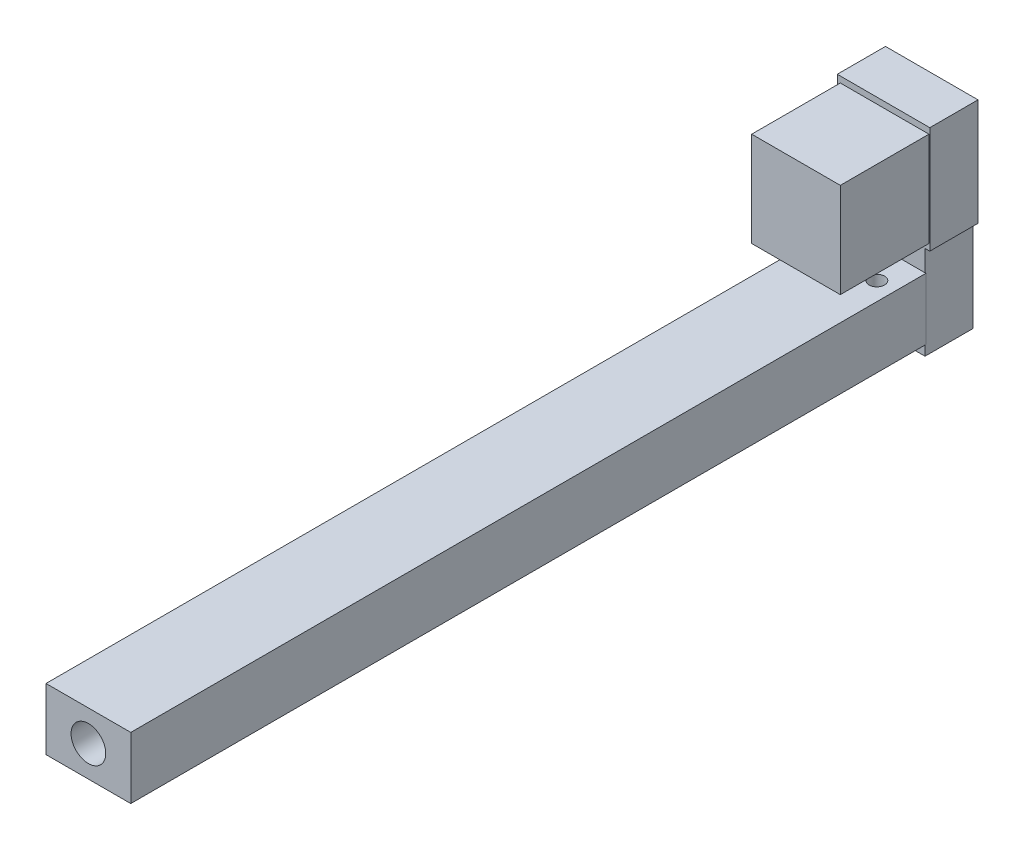
ISO-10303-21;
HEADER;
FILE_DESCRIPTION(('STEP AP214'),'2;1');
FILE_NAME('part.step','',(''),(''),'','','');
FILE_SCHEMA(('AUTOMOTIVE_DESIGN { 1 0 10303 214 1 1 1 1 }'));
ENDSEC;
DATA;
#1=APPLICATION_CONTEXT('core data for automotive mechanical design processes');
#2=APPLICATION_PROTOCOL_DEFINITION('international standard','automotive_design',2000,#1);
#3=PRODUCT_CONTEXT('',#1,'mechanical');
#4=PRODUCT('Part','Part','',(#3));
#5=PRODUCT_RELATED_PRODUCT_CATEGORY('part','',(#4));
#6=PRODUCT_DEFINITION_FORMATION('','',#4);
#7=PRODUCT_DEFINITION_CONTEXT('part definition',#1,'design');
#8=PRODUCT_DEFINITION('design','',#6,#7);
#9=PRODUCT_DEFINITION_SHAPE('','',#8);
#10=(LENGTH_UNIT() NAMED_UNIT(*) SI_UNIT(.MILLI.,.METRE.));
#11=(NAMED_UNIT(*) PLANE_ANGLE_UNIT() SI_UNIT($,.RADIAN.));
#12=(NAMED_UNIT(*) SI_UNIT($,.STERADIAN.) SOLID_ANGLE_UNIT());
#13=UNCERTAINTY_MEASURE_WITH_UNIT(LENGTH_MEASURE(1.E-05),#10,'distance_accuracy_value','');
#14=(GEOMETRIC_REPRESENTATION_CONTEXT(3) GLOBAL_UNCERTAINTY_ASSIGNED_CONTEXT((#13)) GLOBAL_UNIT_ASSIGNED_CONTEXT((#10,
#11,#12)) REPRESENTATION_CONTEXT('',''));
#15=CARTESIAN_POINT('',(0.,0.,0.));
#16=DIRECTION('',(0.,0.,1.));
#17=DIRECTION('',(1.,0.,0.));
#18=AXIS2_PLACEMENT_3D('',#15,#16,#17);
#19=CARTESIAN_POINT('',(68.326,0.,0.));
#20=DIRECTION('',(0.,0.,-1.));
#21=DIRECTION('',(0.,1.,0.));
#22=AXIS2_PLACEMENT_3D('',#19,#20,#21);
#23=PLANE('',#22);
#24=DIRECTION('',(-1.,0.,0.));
#25=VECTOR('',#24,1.);
#26=CARTESIAN_POINT('',(69.85,50.8000000000002,0.));
#27=LINE('',#26,#25);
#28=CARTESIAN_POINT('',(68.326,50.8000000000002,0.));
#29=VERTEX_POINT('',#28);
#30=CARTESIAN_POINT('',(-68.326,50.8000000000002,0.));
#31=VERTEX_POINT('',#30);
#32=EDGE_CURVE('E282',#29,#31,#27,.T.);
#33=ORIENTED_EDGE('',*,*,#32,.F.);
#34=DIRECTION('',(0.,-1.,0.));
#35=VECTOR('',#34,1.);
#36=CARTESIAN_POINT('',(68.326,85.598,0.));
#37=LINE('',#36,#35);
#38=CARTESIAN_POINT('',(68.326,85.598,0.));
#39=VERTEX_POINT('',#38);
#40=EDGE_CURVE('E234',#39,#29,#37,.T.);
#41=ORIENTED_EDGE('',*,*,#40,.F.);
#42=DIRECTION('',(-1.,0.,0.));
#43=VECTOR('',#42,1.);
#44=CARTESIAN_POINT('',(76.23,85.598,0.));
#45=LINE('',#44,#43);
#46=CARTESIAN_POINT('',(76.23,85.598,0.));
#47=VERTEX_POINT('',#46);
#48=EDGE_CURVE('E223',#47,#39,#45,.T.);
#49=ORIENTED_EDGE('',*,*,#48,.F.);
#50=DIRECTION('',(0.,-1.,0.));
#51=VECTOR('',#50,1.);
#52=CARTESIAN_POINT('',(76.23,85.598,0.));
#53=LINE('',#52,#51);
#54=CARTESIAN_POINT('',(76.23,261.868,0.));
#55=VERTEX_POINT('',#54);
#56=EDGE_CURVE('E197',#55,#47,#53,.T.);
#57=ORIENTED_EDGE('',*,*,#56,.F.);
#58=DIRECTION('',(-1.,0.,0.));
#59=VECTOR('',#58,1.);
#60=CARTESIAN_POINT('',(76.23,261.868,0.));
#61=LINE('',#60,#59);
#62=CARTESIAN_POINT('',(-76.23,261.868,0.));
#63=VERTEX_POINT('',#62);
#64=EDGE_CURVE('E206',#55,#63,#61,.T.);
#65=ORIENTED_EDGE('',*,*,#64,.T.);
#66=DIRECTION('',(0.,-1.,0.));
#67=VECTOR('',#66,1.);
#68=CARTESIAN_POINT('',(-76.23,85.598,0.));
#69=LINE('',#68,#67);
#70=CARTESIAN_POINT('',(-76.23,85.598,0.));
#71=VERTEX_POINT('',#70);
#72=EDGE_CURVE('E188',#63,#71,#69,.T.);
#73=ORIENTED_EDGE('',*,*,#72,.T.);
#74=CARTESIAN_POINT('',(-68.326,85.598,0.));
#75=VERTEX_POINT('',#74);
#76=EDGE_CURVE('E222',#75,#71,#45,.T.);
#77=ORIENTED_EDGE('',*,*,#76,.F.);
#78=DIRECTION('',(0.,-1.,0.));
#79=VECTOR('',#78,1.);
#80=CARTESIAN_POINT('',(-68.326,0.,0.));
#81=LINE('',#80,#79);
#82=EDGE_CURVE('E50',#75,#31,#81,.T.);
#83=ORIENTED_EDGE('',*,*,#82,.T.);
#84=EDGE_LOOP('',(#33,#41,#49,#57,#65,#73,#77,#83));
#85=FACE_BOUND('',#84,.T.);
#86=DIRECTION('',(0.,-1.,0.));
#87=VECTOR('',#86,1.);
#88=CARTESIAN_POINT('',(-71.23,251.868,0.));
#89=LINE('',#88,#87);
#90=CARTESIAN_POINT('',(-71.23,251.868,0.));
#91=VERTEX_POINT('',#90);
#92=CARTESIAN_POINT('',(-71.23,95.828,0.));
#93=VERTEX_POINT('',#92);
#94=EDGE_CURVE('E187',#91,#93,#89,.T.);
#95=ORIENTED_EDGE('',*,*,#94,.F.);
#96=DIRECTION('',(-1.,0.,0.));
#97=VECTOR('',#96,1.);
#98=CARTESIAN_POINT('',(-71.23,251.868,0.));
#99=LINE('',#98,#97);
#100=CARTESIAN_POINT('',(74.81,251.868,0.));
#101=VERTEX_POINT('',#100);
#102=EDGE_CURVE('E184',#101,#91,#99,.T.);
#103=ORIENTED_EDGE('',*,*,#102,.F.);
#104=DIRECTION('',(0.,1.,0.));
#105=VECTOR('',#104,1.);
#106=CARTESIAN_POINT('',(74.81,251.868,0.));
#107=LINE('',#106,#105);
#108=CARTESIAN_POINT('',(74.81,95.828,0.));
#109=VERTEX_POINT('',#108);
#110=EDGE_CURVE('E63',#109,#101,#107,.T.);
#111=ORIENTED_EDGE('',*,*,#110,.F.);
#112=DIRECTION('',(1.,0.,0.));
#113=VECTOR('',#112,1.);
#114=CARTESIAN_POINT('',(-71.23,95.828,0.));
#115=LINE('',#114,#113);
#116=EDGE_CURVE('E58',#93,#109,#115,.T.);
#117=ORIENTED_EDGE('',*,*,#116,.F.);
#118=EDGE_LOOP('',(#95,#103,#111,#117));
#119=FACE_BOUND('',#118,.T.);
#120=ADVANCED_FACE('F39',(#85,#119),#23,.F.);
#121=CARTESIAN_POINT('',(69.85,50.8000000000002,0.));
#122=DIRECTION('',(0.,0.,1.));
#123=DIRECTION('',(0.,-1.,0.));
#124=AXIS2_PLACEMENT_3D('',#121,#122,#123);
#125=PLANE('',#124);
#126=CARTESIAN_POINT('',(68.326,-50.8000000000002,0.));
#127=VERTEX_POINT('',#126);
#128=EDGE_CURVE('E48',#29,#127,#37,.T.);
#129=ORIENTED_EDGE('',*,*,#128,.F.);
#130=CARTESIAN_POINT('',(69.85,50.8000000000002,0.));
#131=VERTEX_POINT('',#130);
#132=EDGE_CURVE('E280',#131,#29,#27,.T.);
#133=ORIENTED_EDGE('',*,*,#132,.F.);
#134=DIRECTION('',(0.,1.,0.));
#135=VECTOR('',#134,1.);
#136=CARTESIAN_POINT('',(69.85,50.8000000000002,0.));
#137=LINE('',#136,#135);
#138=CARTESIAN_POINT('',(69.85,-50.8000000000002,0.));
#139=VERTEX_POINT('',#138);
#140=EDGE_CURVE('E252',#139,#131,#137,.T.);
#141=ORIENTED_EDGE('',*,*,#140,.F.);
#142=DIRECTION('',(-1.,0.,0.));
#143=VECTOR('',#142,1.);
#144=CARTESIAN_POINT('',(69.85,-50.8000000000002,0.));
#145=LINE('',#144,#143);
#146=EDGE_CURVE('E271',#139,#127,#145,.T.);
#147=ORIENTED_EDGE('',*,*,#146,.T.);
#148=EDGE_LOOP('',(#129,#133,#141,#147));
#149=FACE_BOUND('',#148,.T.);
#150=ADVANCED_FACE('F313',(#149),#125,.F.);
#151=CARTESIAN_POINT('',(-69.85,50.8000000000002,0.));
#152=VERTEX_POINT('',#151);
#153=EDGE_CURVE('E279',#31,#152,#27,.T.);
#154=ORIENTED_EDGE('',*,*,#153,.F.);
#155=CARTESIAN_POINT('',(-68.326,-50.8000000000002,0.));
#156=VERTEX_POINT('',#155);
#157=EDGE_CURVE('E11',#31,#156,#81,.T.);
#158=ORIENTED_EDGE('',*,*,#157,.T.);
#159=CARTESIAN_POINT('',(-69.85,-50.8000000000002,0.));
#160=VERTEX_POINT('',#159);
#161=EDGE_CURVE('E262',#156,#160,#145,.T.);
#162=ORIENTED_EDGE('',*,*,#161,.T.);
#163=DIRECTION('',(0.,1.,0.));
#164=VECTOR('',#163,1.);
#165=CARTESIAN_POINT('',(-69.85,50.8000000000002,0.));
#166=LINE('',#165,#164);
#167=EDGE_CURVE('E251',#160,#152,#166,.T.);
#168=ORIENTED_EDGE('',*,*,#167,.T.);
#169=EDGE_LOOP('',(#154,#158,#162,#168));
#170=FACE_BOUND('',#169,.T.);
#171=ADVANCED_FACE('F41',(#170),#125,.F.);
#172=CARTESIAN_POINT('',(69.85,50.8000000000002,0.));
#173=DIRECTION('',(0.,-1.,0.));
#174=DIRECTION('',(0.,0.,-1.));
#175=AXIS2_PLACEMENT_3D('',#172,#173,#174);
#176=PLANE('',#175);
#177=CARTESIAN_POINT('',(39.81,50.8000000000002,50.7999999999999));
#178=DIRECTION('',(0.,-1.,0.));
#179=DIRECTION('',(0.,0.,-1.));
#180=AXIS2_PLACEMENT_3D('',#177,#178,#179);
#181=CIRCLE('',#180,12.7);
#182=CARTESIAN_POINT('',(39.81,50.8000000000002,38.0999999999999));
#183=VERTEX_POINT('',#182);
#184=EDGE_CURVE('E397',#183,#183,#181,.T.);
#185=ORIENTED_EDGE('',*,*,#184,.T.);
#186=EDGE_LOOP('',(#185));
#187=FACE_BOUND('',#186,.T.);
#188=DIRECTION('',(0.,0.,1.));
#189=VECTOR('',#188,1.);
#190=CARTESIAN_POINT('',(-69.85,50.8000000000002,0.));
#191=LINE('',#190,#189);
#192=CARTESIAN_POINT('',(-69.85,50.7999999999996,1310.386));
#193=VERTEX_POINT('',#192);
#194=EDGE_CURVE('E265',#152,#193,#191,.T.);
#195=ORIENTED_EDGE('',*,*,#194,.T.);
#196=DIRECTION('',(-1.,0.,0.));
#197=VECTOR('',#196,1.);
#198=CARTESIAN_POINT('',(69.85,50.7999999999996,1310.386));
#199=LINE('',#198,#197);
#200=CARTESIAN_POINT('',(69.85,50.7999999999996,1310.386));
#201=VERTEX_POINT('',#200);
#202=EDGE_CURVE('E277',#201,#193,#199,.T.);
#203=ORIENTED_EDGE('',*,*,#202,.F.);
#204=DIRECTION('',(0.,0.,1.));
#205=VECTOR('',#204,1.);
#206=CARTESIAN_POINT('',(69.85,50.8000000000002,0.));
#207=LINE('',#206,#205);
#208=EDGE_CURVE('E255',#131,#201,#207,.T.);
#209=ORIENTED_EDGE('',*,*,#208,.F.);
#210=ORIENTED_EDGE('',*,*,#132,.T.);
#211=ORIENTED_EDGE('',*,*,#32,.T.);
#212=ORIENTED_EDGE('',*,*,#153,.T.);
#213=EDGE_LOOP('',(#195,#203,#209,#210,#211,#212));
#214=FACE_BOUND('',#213,.T.);
#215=ADVANCED_FACE('F289',(#187,#214),#176,.F.);
#216=CARTESIAN_POINT('',(69.85,50.7999999999996,1310.386));
#217=DIRECTION('',(0.,0.,-1.));
#218=DIRECTION('',(-1.,0.,0.));
#219=AXIS2_PLACEMENT_3D('',#216,#217,#218);
#220=PLANE('',#219);
#221=CARTESIAN_POINT('',(0.,0.,1310.386));
#222=DIRECTION('',(0.,0.,1.));
#223=DIRECTION('',(1.,0.,0.));
#224=AXIS2_PLACEMENT_3D('',#221,#222,#223);
#225=CIRCLE('',#224,28.575);
#226=CARTESIAN_POINT('',(28.575,0.,1310.386));
#227=VERTEX_POINT('',#226);
#228=EDGE_CURVE('E399',#227,#227,#225,.T.);
#229=ORIENTED_EDGE('',*,*,#228,.F.);
#230=EDGE_LOOP('',(#229));
#231=FACE_BOUND('',#230,.T.);
#232=DIRECTION('',(0.,-1.,0.));
#233=VECTOR('',#232,1.);
#234=CARTESIAN_POINT('',(-69.85,50.7999999999996,1310.386));
#235=LINE('',#234,#233);
#236=CARTESIAN_POINT('',(-69.85,-50.8000000000004,1310.386));
#237=VERTEX_POINT('',#236);
#238=EDGE_CURVE('E267',#193,#237,#235,.T.);
#239=ORIENTED_EDGE('',*,*,#238,.T.);
#240=DIRECTION('',(-1.,0.,0.));
#241=VECTOR('',#240,1.);
#242=CARTESIAN_POINT('',(69.85,-50.8000000000004,1310.386));
#243=LINE('',#242,#241);
#244=CARTESIAN_POINT('',(69.85,-50.8000000000004,1310.386));
#245=VERTEX_POINT('',#244);
#246=EDGE_CURVE('E273',#245,#237,#243,.T.);
#247=ORIENTED_EDGE('',*,*,#246,.F.);
#248=DIRECTION('',(0.,-1.,0.));
#249=VECTOR('',#248,1.);
#250=CARTESIAN_POINT('',(69.85,50.7999999999996,1310.386));
#251=LINE('',#250,#249);
#252=EDGE_CURVE('E258',#201,#245,#251,.T.);
#253=ORIENTED_EDGE('',*,*,#252,.F.);
#254=ORIENTED_EDGE('',*,*,#202,.T.);
#255=EDGE_LOOP('',(#239,#247,#253,#254));
#256=FACE_BOUND('',#255,.T.);
#257=ADVANCED_FACE('F308',(#231,#256),#220,.F.);
#258=CARTESIAN_POINT('',(69.85,-50.8000000000002,0.));
#259=DIRECTION('',(0.,1.,0.));
#260=DIRECTION('',(0.,0.,1.));
#261=AXIS2_PLACEMENT_3D('',#258,#259,#260);
#262=PLANE('',#261);
#263=CARTESIAN_POINT('',(39.81,-50.8000000000002,50.7999999999998));
#264=DIRECTION('',(0.,1.,0.));
#265=DIRECTION('',(0.,0.,1.));
#266=AXIS2_PLACEMENT_3D('',#263,#264,#265);
#267=CIRCLE('',#266,12.7);
#268=CARTESIAN_POINT('',(39.81,-50.8000000000002,63.4999999999999));
#269=VERTEX_POINT('',#268);
#270=EDGE_CURVE('E43',#269,#269,#267,.T.);
#271=ORIENTED_EDGE('',*,*,#270,.T.);
#272=EDGE_LOOP('',(#271));
#273=FACE_BOUND('',#272,.T.);
#274=DIRECTION('',(0.,0.,-1.));
#275=VECTOR('',#274,1.);
#276=CARTESIAN_POINT('',(-69.85,-50.8000000000002,0.));
#277=LINE('',#276,#275);
#278=EDGE_CURVE('E256',#237,#160,#277,.T.);
#279=ORIENTED_EDGE('',*,*,#278,.T.);
#280=ORIENTED_EDGE('',*,*,#161,.F.);
#281=EDGE_CURVE('E274',#127,#156,#145,.T.);
#282=ORIENTED_EDGE('',*,*,#281,.F.);
#283=ORIENTED_EDGE('',*,*,#146,.F.);
#284=DIRECTION('',(0.,0.,-1.));
#285=VECTOR('',#284,1.);
#286=CARTESIAN_POINT('',(69.85,-50.8000000000002,0.));
#287=LINE('',#286,#285);
#288=EDGE_CURVE('E260',#245,#139,#287,.T.);
#289=ORIENTED_EDGE('',*,*,#288,.F.);
#290=ORIENTED_EDGE('',*,*,#246,.T.);
#291=EDGE_LOOP('',(#279,#280,#282,#283,#289,#290));
#292=FACE_BOUND('',#291,.T.);
#293=ADVANCED_FACE('F302',(#273,#292),#262,.F.);
#294=CARTESIAN_POINT('',(69.85,0.,0.));
#295=DIRECTION('',(-1.,0.,0.));
#296=DIRECTION('',(0.,0.,1.));
#297=AXIS2_PLACEMENT_3D('',#294,#295,#296);
#298=PLANE('',#297);
#299=ORIENTED_EDGE('',*,*,#140,.T.);
#300=ORIENTED_EDGE('',*,*,#208,.T.);
#301=ORIENTED_EDGE('',*,*,#252,.T.);
#302=ORIENTED_EDGE('',*,*,#288,.T.);
#303=EDGE_LOOP('',(#299,#300,#301,#302));
#304=FACE_BOUND('',#303,.T.);
#305=ADVANCED_FACE('F311',(#304),#298,.F.);
#306=CARTESIAN_POINT('',(-69.85,0.,0.));
#307=DIRECTION('',(-1.,0.,0.));
#308=DIRECTION('',(0.,0.,1.));
#309=AXIS2_PLACEMENT_3D('',#306,#307,#308);
#310=PLANE('',#309);
#311=ORIENTED_EDGE('',*,*,#167,.F.);
#312=ORIENTED_EDGE('',*,*,#278,.F.);
#313=ORIENTED_EDGE('',*,*,#238,.F.);
#314=ORIENTED_EDGE('',*,*,#194,.F.);
#315=EDGE_LOOP('',(#311,#312,#313,#314));
#316=FACE_BOUND('',#315,.T.);
#317=ADVANCED_FACE('F296',(#316),#310,.T.);
#318=CARTESIAN_POINT('',(68.326,-68.326,0.));
#319=VERTEX_POINT('',#318);
#320=EDGE_CURVE('E233',#127,#319,#37,.T.);
#321=ORIENTED_EDGE('',*,*,#320,.F.);
#322=ORIENTED_EDGE('',*,*,#281,.T.);
#323=CARTESIAN_POINT('',(-68.326,-68.326,0.));
#324=VERTEX_POINT('',#323);
#325=EDGE_CURVE('E51',#156,#324,#81,.T.);
#326=ORIENTED_EDGE('',*,*,#325,.T.);
#327=DIRECTION('',(-1.,0.,0.));
#328=VECTOR('',#327,1.);
#329=CARTESIAN_POINT('',(68.326,-68.326,0.));
#330=LINE('',#329,#328);
#331=EDGE_CURVE('E248',#319,#324,#330,.T.);
#332=ORIENTED_EDGE('',*,*,#331,.F.);
#333=EDGE_LOOP('',(#321,#322,#326,#332));
#334=FACE_BOUND('',#333,.T.);
#335=ADVANCED_FACE('F331',(#334),#23,.F.);
#336=CARTESIAN_POINT('',(68.326,-68.326,-79.4308383840396));
#337=DIRECTION('',(0.,0.,1.));
#338=DIRECTION('',(1.,0.,0.));
#339=AXIS2_PLACEMENT_3D('',#336,#337,#338);
#340=PLANE('',#339);
#341=DIRECTION('',(0.,1.,0.));
#342=VECTOR('',#341,1.);
#343=CARTESIAN_POINT('',(-68.326,-68.326,-79.4308383840396));
#344=LINE('',#343,#342);
#345=CARTESIAN_POINT('',(-68.326,-68.326,-79.4308383840396));
#346=VERTEX_POINT('',#345);
#347=CARTESIAN_POINT('',(-68.326,85.598,-79.4308383840396));
#348=VERTEX_POINT('',#347);
#349=EDGE_CURVE('E225',#346,#348,#344,.T.);
#350=ORIENTED_EDGE('',*,*,#349,.T.);
#351=DIRECTION('',(-1.,0.,0.));
#352=VECTOR('',#351,1.);
#353=CARTESIAN_POINT('',(76.23,85.598,-79.4308383840396));
#354=LINE('',#353,#352);
#355=CARTESIAN_POINT('',(-76.23,85.598,-79.4308383840396));
#356=VERTEX_POINT('',#355);
#357=EDGE_CURVE('E218',#348,#356,#354,.T.);
#358=ORIENTED_EDGE('',*,*,#357,.T.);
#359=DIRECTION('',(0.,1.,0.));
#360=VECTOR('',#359,1.);
#361=CARTESIAN_POINT('',(-76.23,85.598,-79.4308383840396));
#362=LINE('',#361,#360);
#363=CARTESIAN_POINT('',(-76.23,261.868,-79.4308383840396));
#364=VERTEX_POINT('',#363);
#365=EDGE_CURVE('E210',#356,#364,#362,.T.);
#366=ORIENTED_EDGE('',*,*,#365,.T.);
#367=DIRECTION('',(-1.,0.,0.));
#368=VECTOR('',#367,1.);
#369=CARTESIAN_POINT('',(76.23,261.868,-79.4308383840396));
#370=LINE('',#369,#368);
#371=CARTESIAN_POINT('',(76.23,261.868,-79.4308383840396));
#372=VERTEX_POINT('',#371);
#373=EDGE_CURVE('E215',#372,#364,#370,.T.);
#374=ORIENTED_EDGE('',*,*,#373,.F.);
#375=DIRECTION('',(0.,1.,0.));
#376=VECTOR('',#375,1.);
#377=CARTESIAN_POINT('',(76.23,85.598,-79.4308383840396));
#378=LINE('',#377,#376);
#379=CARTESIAN_POINT('',(76.23,85.598,-79.4308383840396));
#380=VERTEX_POINT('',#379);
#381=EDGE_CURVE('E203',#380,#372,#378,.T.);
#382=ORIENTED_EDGE('',*,*,#381,.F.);
#383=CARTESIAN_POINT('',(68.326,85.598,-79.4308383840396));
#384=VERTEX_POINT('',#383);
#385=EDGE_CURVE('E219',#380,#384,#354,.T.);
#386=ORIENTED_EDGE('',*,*,#385,.T.);
#387=DIRECTION('',(0.,1.,0.));
#388=VECTOR('',#387,1.);
#389=CARTESIAN_POINT('',(68.326,-68.326,-79.4308383840396));
#390=LINE('',#389,#388);
#391=CARTESIAN_POINT('',(68.326,-68.326,-79.4308383840396));
#392=VERTEX_POINT('',#391);
#393=EDGE_CURVE('E226',#392,#384,#390,.T.);
#394=ORIENTED_EDGE('',*,*,#393,.F.);
#395=DIRECTION('',(-1.,0.,0.));
#396=VECTOR('',#395,1.);
#397=CARTESIAN_POINT('',(68.326,-68.326,-79.4308383840396));
#398=LINE('',#397,#396);
#399=EDGE_CURVE('E239',#392,#346,#398,.T.);
#400=ORIENTED_EDGE('',*,*,#399,.T.);
#401=EDGE_LOOP('',(#350,#358,#366,#374,#382,#386,#394,#400));
#402=FACE_BOUND('',#401,.T.);
#403=ADVANCED_FACE('F338',(#402),#340,.F.);
#404=CARTESIAN_POINT('',(68.326,-68.326,0.));
#405=DIRECTION('',(0.,1.,0.));
#406=DIRECTION('',(0.,0.,1.));
#407=AXIS2_PLACEMENT_3D('',#404,#405,#406);
#408=PLANE('',#407);
#409=DIRECTION('',(0.,0.,-1.));
#410=VECTOR('',#409,1.);
#411=CARTESIAN_POINT('',(-68.326,-68.326,0.));
#412=LINE('',#411,#410);
#413=EDGE_CURVE('E230',#324,#346,#412,.T.);
#414=ORIENTED_EDGE('',*,*,#413,.T.);
#415=ORIENTED_EDGE('',*,*,#399,.F.);
#416=DIRECTION('',(0.,0.,-1.));
#417=VECTOR('',#416,1.);
#418=CARTESIAN_POINT('',(68.326,-68.326,0.));
#419=LINE('',#418,#417);
#420=EDGE_CURVE('E237',#319,#392,#419,.T.);
#421=ORIENTED_EDGE('',*,*,#420,.F.);
#422=ORIENTED_EDGE('',*,*,#331,.T.);
#423=EDGE_LOOP('',(#414,#415,#421,#422));
#424=FACE_BOUND('',#423,.T.);
#425=ADVANCED_FACE('F334',(#424),#408,.F.);
#426=CARTESIAN_POINT('',(68.326,0.,0.));
#427=DIRECTION('',(1.,0.,0.));
#428=DIRECTION('',(0.,0.,-1.));
#429=AXIS2_PLACEMENT_3D('',#426,#427,#428);
#430=PLANE('',#429);
#431=ORIENTED_EDGE('',*,*,#393,.T.);
#432=DIRECTION('',(0.,0.,1.));
#433=VECTOR('',#432,1.);
#434=CARTESIAN_POINT('',(68.326,85.598,-79.4308383840396));
#435=LINE('',#434,#433);
#436=EDGE_CURVE('E229',#384,#39,#435,.T.);
#437=ORIENTED_EDGE('',*,*,#436,.T.);
#438=ORIENTED_EDGE('',*,*,#40,.T.);
#439=ORIENTED_EDGE('',*,*,#128,.T.);
#440=ORIENTED_EDGE('',*,*,#320,.T.);
#441=ORIENTED_EDGE('',*,*,#420,.T.);
#442=EDGE_LOOP('',(#431,#437,#438,#439,#440,#441));
#443=FACE_BOUND('',#442,.T.);
#444=ADVANCED_FACE('F315',(#443),#430,.T.);
#445=CARTESIAN_POINT('',(-68.326,0.,0.));
#446=DIRECTION('',(1.,0.,0.));
#447=DIRECTION('',(0.,0.,-1.));
#448=AXIS2_PLACEMENT_3D('',#445,#446,#447);
#449=PLANE('',#448);
#450=ORIENTED_EDGE('',*,*,#349,.F.);
#451=ORIENTED_EDGE('',*,*,#413,.F.);
#452=ORIENTED_EDGE('',*,*,#325,.F.);
#453=ORIENTED_EDGE('',*,*,#157,.F.);
#454=ORIENTED_EDGE('',*,*,#82,.F.);
#455=DIRECTION('',(0.,0.,1.));
#456=VECTOR('',#455,1.);
#457=CARTESIAN_POINT('',(-68.326,85.598,-79.4308383840396));
#458=LINE('',#457,#456);
#459=EDGE_CURVE('E242',#348,#75,#458,.T.);
#460=ORIENTED_EDGE('',*,*,#459,.F.);
#461=EDGE_LOOP('',(#450,#451,#452,#453,#454,#460));
#462=FACE_BOUND('',#461,.T.);
#463=ADVANCED_FACE('F327',(#462),#449,.F.);
#464=CARTESIAN_POINT('',(76.23,85.598,0.));
#465=DIRECTION('',(0.,1.,0.));
#466=DIRECTION('',(0.,0.,1.));
#467=AXIS2_PLACEMENT_3D('',#464,#465,#466);
#468=PLANE('',#467);
#469=ORIENTED_EDGE('',*,*,#357,.F.);
#470=ORIENTED_EDGE('',*,*,#459,.T.);
#471=ORIENTED_EDGE('',*,*,#76,.T.);
#472=DIRECTION('',(0.,0.,-1.));
#473=VECTOR('',#472,1.);
#474=CARTESIAN_POINT('',(-76.23,85.598,0.));
#475=LINE('',#474,#473);
#476=EDGE_CURVE('E191',#71,#356,#475,.T.);
#477=ORIENTED_EDGE('',*,*,#476,.T.);
#478=EDGE_LOOP('',(#469,#470,#471,#477));
#479=FACE_BOUND('',#478,.T.);
#480=ADVANCED_FACE('F356',(#479),#468,.F.);
#481=ORIENTED_EDGE('',*,*,#436,.F.);
#482=ORIENTED_EDGE('',*,*,#385,.F.);
#483=DIRECTION('',(0.,0.,-1.));
#484=VECTOR('',#483,1.);
#485=CARTESIAN_POINT('',(76.23,85.598,0.));
#486=LINE('',#485,#484);
#487=EDGE_CURVE('E200',#47,#380,#486,.T.);
#488=ORIENTED_EDGE('',*,*,#487,.F.);
#489=ORIENTED_EDGE('',*,*,#48,.T.);
#490=EDGE_LOOP('',(#481,#482,#488,#489));
#491=FACE_BOUND('',#490,.T.);
#492=ADVANCED_FACE('F343',(#491),#468,.F.);
#493=CARTESIAN_POINT('',(76.23,261.868,0.));
#494=DIRECTION('',(0.,-1.,0.));
#495=DIRECTION('',(0.,0.,-1.));
#496=AXIS2_PLACEMENT_3D('',#493,#494,#495);
#497=PLANE('',#496);
#498=DIRECTION('',(0.,0.,1.));
#499=VECTOR('',#498,1.);
#500=CARTESIAN_POINT('',(-76.23,261.868,0.));
#501=LINE('',#500,#499);
#502=EDGE_CURVE('E201',#364,#63,#501,.T.);
#503=ORIENTED_EDGE('',*,*,#502,.T.);
#504=ORIENTED_EDGE('',*,*,#64,.F.);
#505=DIRECTION('',(0.,0.,1.));
#506=VECTOR('',#505,1.);
#507=CARTESIAN_POINT('',(76.23,261.868,0.));
#508=LINE('',#507,#506);
#509=EDGE_CURVE('E205',#372,#55,#508,.T.);
#510=ORIENTED_EDGE('',*,*,#509,.F.);
#511=ORIENTED_EDGE('',*,*,#373,.T.);
#512=EDGE_LOOP('',(#503,#504,#510,#511));
#513=FACE_BOUND('',#512,.T.);
#514=ADVANCED_FACE('F357',(#513),#497,.F.);
#515=CARTESIAN_POINT('',(76.23,0.,0.));
#516=DIRECTION('',(-1.,0.,0.));
#517=DIRECTION('',(0.,0.,1.));
#518=AXIS2_PLACEMENT_3D('',#515,#516,#517);
#519=PLANE('',#518);
#520=ORIENTED_EDGE('',*,*,#56,.T.);
#521=ORIENTED_EDGE('',*,*,#487,.T.);
#522=ORIENTED_EDGE('',*,*,#381,.T.);
#523=ORIENTED_EDGE('',*,*,#509,.T.);
#524=EDGE_LOOP('',(#520,#521,#522,#523));
#525=FACE_BOUND('',#524,.T.);
#526=ADVANCED_FACE('F345',(#525),#519,.F.);
#527=CARTESIAN_POINT('',(-76.23,0.,0.));
#528=DIRECTION('',(-1.,0.,0.));
#529=DIRECTION('',(0.,0.,1.));
#530=AXIS2_PLACEMENT_3D('',#527,#528,#529);
#531=PLANE('',#530);
#532=ORIENTED_EDGE('',*,*,#72,.F.);
#533=ORIENTED_EDGE('',*,*,#502,.F.);
#534=ORIENTED_EDGE('',*,*,#365,.F.);
#535=ORIENTED_EDGE('',*,*,#476,.F.);
#536=EDGE_LOOP('',(#532,#533,#534,#535));
#537=FACE_BOUND('',#536,.T.);
#538=ADVANCED_FACE('F353',(#537),#531,.T.);
#539=CARTESIAN_POINT('',(-71.23,251.868,146.05));
#540=DIRECTION('',(1.,0.,0.));
#541=DIRECTION('',(0.,0.,-1.));
#542=AXIS2_PLACEMENT_3D('',#539,#540,#541);
#543=PLANE('',#542);
#544=ORIENTED_EDGE('',*,*,#94,.T.);
#545=DIRECTION('',(0.,0.,-1.));
#546=VECTOR('',#545,1.);
#547=CARTESIAN_POINT('',(-71.23,95.828,146.05));
#548=LINE('',#547,#546);
#549=CARTESIAN_POINT('',(-71.23,95.828,146.05));
#550=VERTEX_POINT('',#549);
#551=EDGE_CURVE('E168',#550,#93,#548,.T.);
#552=ORIENTED_EDGE('',*,*,#551,.F.);
#553=DIRECTION('',(0.,-1.,0.));
#554=VECTOR('',#553,1.);
#555=CARTESIAN_POINT('',(-71.23,251.868,146.05));
#556=LINE('',#555,#554);
#557=CARTESIAN_POINT('',(-71.23,251.868,146.05));
#558=VERTEX_POINT('',#557);
#559=EDGE_CURVE('E175',#558,#550,#556,.T.);
#560=ORIENTED_EDGE('',*,*,#559,.F.);
#561=DIRECTION('',(0.,0.,-1.));
#562=VECTOR('',#561,1.);
#563=CARTESIAN_POINT('',(-71.23,251.868,146.05));
#564=LINE('',#563,#562);
#565=EDGE_CURVE('E410',#558,#91,#564,.T.);
#566=ORIENTED_EDGE('',*,*,#565,.T.);
#567=EDGE_LOOP('',(#544,#552,#560,#566));
#568=FACE_BOUND('',#567,.T.);
#569=ADVANCED_FACE('F186',(#568),#543,.F.);
#570=CARTESIAN_POINT('',(-71.23,95.828,146.05));
#571=DIRECTION('',(0.,1.,0.));
#572=DIRECTION('',(0.,0.,1.));
#573=AXIS2_PLACEMENT_3D('',#570,#571,#572);
#574=PLANE('',#573);
#575=ORIENTED_EDGE('',*,*,#116,.T.);
#576=DIRECTION('',(0.,0.,-1.));
#577=VECTOR('',#576,1.);
#578=CARTESIAN_POINT('',(74.81,95.828,146.05));
#579=LINE('',#578,#577);
#580=CARTESIAN_POINT('',(74.81,95.828,146.05));
#581=VERTEX_POINT('',#580);
#582=EDGE_CURVE('E171',#581,#109,#579,.T.);
#583=ORIENTED_EDGE('',*,*,#582,.F.);
#584=DIRECTION('',(1.,0.,0.));
#585=VECTOR('',#584,1.);
#586=CARTESIAN_POINT('',(-71.23,95.828,146.05));
#587=LINE('',#586,#585);
#588=EDGE_CURVE('E164',#550,#581,#587,.T.);
#589=ORIENTED_EDGE('',*,*,#588,.F.);
#590=ORIENTED_EDGE('',*,*,#551,.T.);
#591=EDGE_LOOP('',(#575,#583,#589,#590));
#592=FACE_BOUND('',#591,.T.);
#593=ADVANCED_FACE('F166',(#592),#574,.F.);
#594=CARTESIAN_POINT('',(74.81,251.868,146.05));
#595=DIRECTION('',(-1.,0.,0.));
#596=DIRECTION('',(0.,-1.,0.));
#597=AXIS2_PLACEMENT_3D('',#594,#595,#596);
#598=PLANE('',#597);
#599=ORIENTED_EDGE('',*,*,#110,.T.);
#600=DIRECTION('',(0.,0.,-1.));
#601=VECTOR('',#600,1.);
#602=CARTESIAN_POINT('',(74.81,251.868,146.05));
#603=LINE('',#602,#601);
#604=CARTESIAN_POINT('',(74.81,251.868,146.05));
#605=VERTEX_POINT('',#604);
#606=EDGE_CURVE('E193',#605,#101,#603,.T.);
#607=ORIENTED_EDGE('',*,*,#606,.F.);
#608=DIRECTION('',(0.,1.,0.));
#609=VECTOR('',#608,1.);
#610=CARTESIAN_POINT('',(74.81,251.868,146.05));
#611=LINE('',#610,#609);
#612=EDGE_CURVE('E174',#581,#605,#611,.T.);
#613=ORIENTED_EDGE('',*,*,#612,.F.);
#614=ORIENTED_EDGE('',*,*,#582,.T.);
#615=EDGE_LOOP('',(#599,#607,#613,#614));
#616=FACE_BOUND('',#615,.T.);
#617=ADVANCED_FACE('F421',(#616),#598,.F.);
#618=CARTESIAN_POINT('',(-71.23,251.868,146.05));
#619=DIRECTION('',(0.,-1.,0.));
#620=DIRECTION('',(0.,0.,-1.));
#621=AXIS2_PLACEMENT_3D('',#618,#619,#620);
#622=PLANE('',#621);
#623=ORIENTED_EDGE('',*,*,#102,.T.);
#624=ORIENTED_EDGE('',*,*,#565,.F.);
#625=DIRECTION('',(-1.,0.,0.));
#626=VECTOR('',#625,1.);
#627=CARTESIAN_POINT('',(-71.23,251.868,146.05));
#628=LINE('',#627,#626);
#629=EDGE_CURVE('E180',#605,#558,#628,.T.);
#630=ORIENTED_EDGE('',*,*,#629,.F.);
#631=ORIENTED_EDGE('',*,*,#606,.T.);
#632=EDGE_LOOP('',(#623,#624,#630,#631));
#633=FACE_BOUND('',#632,.T.);
#634=ADVANCED_FACE('F419',(#633),#622,.F.);
#635=CARTESIAN_POINT('',(0.,0.,146.05));
#636=DIRECTION('',(0.,0.,1.));
#637=DIRECTION('',(1.,0.,0.));
#638=AXIS2_PLACEMENT_3D('',#635,#636,#637);
#639=PLANE('',#638);
#640=ORIENTED_EDGE('',*,*,#559,.T.);
#641=ORIENTED_EDGE('',*,*,#588,.T.);
#642=ORIENTED_EDGE('',*,*,#612,.T.);
#643=ORIENTED_EDGE('',*,*,#629,.T.);
#644=EDGE_LOOP('',(#640,#641,#642,#643));
#645=FACE_BOUND('',#644,.T.);
#646=ADVANCED_FACE('F178',(#645),#639,.T.);
#647=CARTESIAN_POINT('',(0.,0.,383.286));
#648=DIRECTION('',(0.,0.,1.));
#649=DIRECTION('',(1.,0.,0.));
#650=AXIS2_PLACEMENT_3D('',#647,#648,#649);
#651=CYLINDRICAL_SURFACE('',#650,28.575);
#652=CARTESIAN_POINT('',(0.,0.,383.286));
#653=DIRECTION('',(0.,0.,1.));
#654=DIRECTION('',(1.,0.,0.));
#655=AXIS2_PLACEMENT_3D('',#652,#653,#654);
#656=CIRCLE('',#655,28.575);
#657=CARTESIAN_POINT('',(28.575,0.,383.286));
#658=VERTEX_POINT('',#657);
#659=EDGE_CURVE('E402',#658,#658,#656,.T.);
#660=ORIENTED_EDGE('',*,*,#659,.F.);
#661=EDGE_LOOP('',(#660));
#662=FACE_BOUND('',#661,.T.);
#663=ORIENTED_EDGE('',*,*,#228,.T.);
#664=EDGE_LOOP('',(#663));
#665=FACE_BOUND('',#664,.T.);
#666=ADVANCED_FACE('F465',(#662,#665),#651,.F.);
#667=CARTESIAN_POINT('',(0.,0.,383.286));
#668=DIRECTION('',(0.,0.,1.));
#669=DIRECTION('',(1.,0.,0.));
#670=AXIS2_PLACEMENT_3D('',#667,#668,#669);
#671=PLANE('',#670);
#672=ORIENTED_EDGE('',*,*,#659,.T.);
#673=EDGE_LOOP('',(#672));
#674=FACE_BOUND('',#673,.T.);
#675=ADVANCED_FACE('F481',(#674),#671,.T.);
#676=CARTESIAN_POINT('',(39.81,-68.3260000000001,50.7999999999998));
#677=DIRECTION('',(0.,1.,0.));
#678=DIRECTION('',(0.,0.,1.));
#679=AXIS2_PLACEMENT_3D('',#676,#677,#678);
#680=CYLINDRICAL_SURFACE('',#679,12.7);
#681=ORIENTED_EDGE('',*,*,#270,.F.);
#682=EDGE_LOOP('',(#681));
#683=FACE_BOUND('',#682,.T.);
#684=ORIENTED_EDGE('',*,*,#184,.F.);
#685=EDGE_LOOP('',(#684));
#686=FACE_BOUND('',#685,.T.);
#687=ADVANCED_FACE('F490',(#683,#686),#680,.F.);
#688=CLOSED_SHELL('',(#120,#150,#171,#215,#257,#293,#305,#317,#335,#403,#425,#444,#463,#480,
#492,#514,#526,#538,#569,#593,#617,#634,#646,#666,#675,#687));
#689=MANIFOLD_SOLID_BREP('B2',#688);
#690=ADVANCED_BREP_SHAPE_REPRESENTATION('',(#18,#689),#14);
#691=SHAPE_DEFINITION_REPRESENTATION(#9,#690);
ENDSEC;
END-ISO-10303-21;
